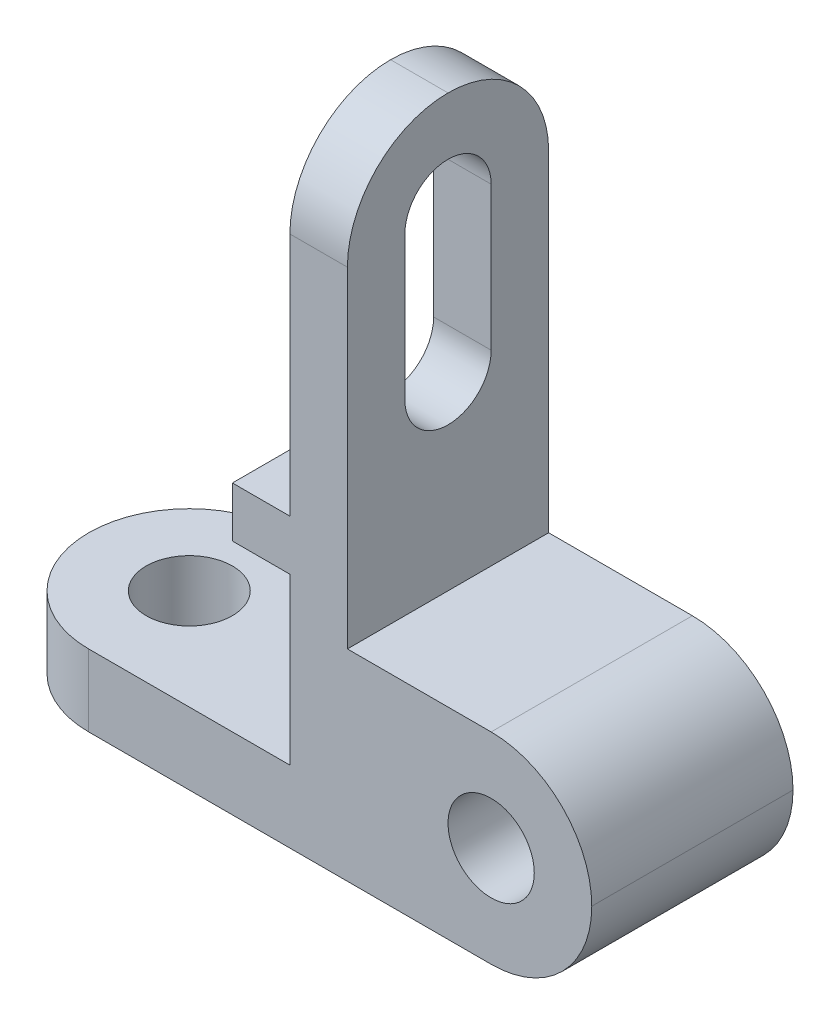
ISO-10303-21;
HEADER;
FILE_DESCRIPTION(('STEP AP214'),'2;1');
FILE_NAME('part.step','',(''),(''),'','','');
FILE_SCHEMA(('AUTOMOTIVE_DESIGN { 1 0 10303 214 1 1 1 1 }'));
ENDSEC;
DATA;
#1=APPLICATION_CONTEXT('core data for automotive mechanical design processes');
#2=APPLICATION_PROTOCOL_DEFINITION('international standard','automotive_design',2000,#1);
#3=PRODUCT_CONTEXT('',#1,'mechanical');
#4=PRODUCT('Part','Part','',(#3));
#5=PRODUCT_RELATED_PRODUCT_CATEGORY('part','',(#4));
#6=PRODUCT_DEFINITION_FORMATION('','',#4);
#7=PRODUCT_DEFINITION_CONTEXT('part definition',#1,'design');
#8=PRODUCT_DEFINITION('design','',#6,#7);
#9=PRODUCT_DEFINITION_SHAPE('','',#8);
#10=(LENGTH_UNIT() NAMED_UNIT(*) SI_UNIT(.MILLI.,.METRE.));
#11=(NAMED_UNIT(*) PLANE_ANGLE_UNIT() SI_UNIT($,.RADIAN.));
#12=(NAMED_UNIT(*) SI_UNIT($,.STERADIAN.) SOLID_ANGLE_UNIT());
#13=UNCERTAINTY_MEASURE_WITH_UNIT(LENGTH_MEASURE(1.E-05),#10,'distance_accuracy_value','');
#14=(GEOMETRIC_REPRESENTATION_CONTEXT(3) GLOBAL_UNCERTAINTY_ASSIGNED_CONTEXT((#13)) GLOBAL_UNIT_ASSIGNED_CONTEXT((#10,
#11,#12)) REPRESENTATION_CONTEXT('',''));
#15=CARTESIAN_POINT('',(0.,0.,0.));
#16=DIRECTION('',(0.,0.,1.));
#17=DIRECTION('',(1.,0.,0.));
#18=AXIS2_PLACEMENT_3D('',#15,#16,#17);
#19=CARTESIAN_POINT('',(0.,0.,14.));
#20=DIRECTION('',(0.,0.,1.));
#21=DIRECTION('',(1.,0.,0.));
#22=AXIS2_PLACEMENT_3D('',#19,#20,#21);
#23=PLANE('',#22);
#24=DIRECTION('',(-1.,0.,0.));
#25=VECTOR('',#24,1.);
#26=CARTESIAN_POINT('',(-42.,9.99999999999999,14.));
#27=LINE('',#26,#25);
#28=CARTESIAN_POINT('',(-42.,9.99999999999999,14.));
#29=VERTEX_POINT('',#28);
#30=CARTESIAN_POINT('',(-70.,9.99999999999999,14.));
#31=VERTEX_POINT('',#30);
#32=EDGE_CURVE('E228',#29,#31,#27,.T.);
#33=ORIENTED_EDGE('',*,*,#32,.T.);
#34=DIRECTION('',(0.,-1.,0.));
#35=VECTOR('',#34,1.);
#36=CARTESIAN_POINT('',(-70.,0.,14.));
#37=LINE('',#36,#35);
#38=CARTESIAN_POINT('',(-70.,0.,14.));
#39=VERTEX_POINT('',#38);
#40=EDGE_CURVE('E294',#31,#39,#37,.T.);
#41=ORIENTED_EDGE('',*,*,#40,.T.);
#42=DIRECTION('',(1.,0.,0.));
#43=VECTOR('',#42,1.);
#44=CARTESIAN_POINT('',(-84.,0.,14.));
#45=LINE('',#44,#43);
#46=CARTESIAN_POINT('',(-14.,0.,14.));
#47=VERTEX_POINT('',#46);
#48=EDGE_CURVE('E209',#39,#47,#45,.T.);
#49=ORIENTED_EDGE('',*,*,#48,.T.);
#50=CARTESIAN_POINT('',(-14.,14.,14.));
#51=DIRECTION('',(0.,0.,1.));
#52=DIRECTION('',(1.,0.,0.));
#53=AXIS2_PLACEMENT_3D('',#50,#51,#52);
#54=CIRCLE('',#53,14.);
#55=CARTESIAN_POINT('',(0.,14.,14.));
#56=VERTEX_POINT('',#55);
#57=EDGE_CURVE('E290',#47,#56,#54,.T.);
#58=ORIENTED_EDGE('',*,*,#57,.T.);
#59=CARTESIAN_POINT('',(-14.,14.,14.));
#60=DIRECTION('',(0.,0.,1.));
#61=DIRECTION('',(1.,0.,0.));
#62=AXIS2_PLACEMENT_3D('',#59,#60,#61);
#63=CIRCLE('',#62,14.);
#64=CARTESIAN_POINT('',(-14.,28.,14.));
#65=VERTEX_POINT('',#64);
#66=EDGE_CURVE('E288',#56,#65,#63,.T.);
#67=ORIENTED_EDGE('',*,*,#66,.T.);
#68=DIRECTION('',(-1.,0.,0.));
#69=VECTOR('',#68,1.);
#70=CARTESIAN_POINT('',(0.,28.,14.));
#71=LINE('',#70,#69);
#72=CARTESIAN_POINT('',(-34.,28.,14.));
#73=VERTEX_POINT('',#72);
#74=EDGE_CURVE('E212',#65,#73,#71,.T.);
#75=ORIENTED_EDGE('',*,*,#74,.T.);
#76=DIRECTION('',(0.,1.,0.));
#77=VECTOR('',#76,1.);
#78=CARTESIAN_POINT('',(-34.,28.,14.));
#79=LINE('',#78,#77);
#80=CARTESIAN_POINT('',(-34.,74.,14.));
#81=VERTEX_POINT('',#80);
#82=EDGE_CURVE('E215',#73,#81,#79,.T.);
#83=ORIENTED_EDGE('',*,*,#82,.T.);
#84=DIRECTION('',(-1.,0.,0.));
#85=VECTOR('',#84,1.);
#86=CARTESIAN_POINT('',(-42.,74.,14.));
#87=LINE('',#86,#85);
#88=CARTESIAN_POINT('',(-42.,74.,14.));
#89=VERTEX_POINT('',#88);
#90=EDGE_CURVE('E292',#81,#89,#87,.T.);
#91=ORIENTED_EDGE('',*,*,#90,.T.);
#92=DIRECTION('',(0.,-1.,0.));
#93=VECTOR('',#92,1.);
#94=CARTESIAN_POINT('',(-42.,88.,14.));
#95=LINE('',#94,#93);
#96=CARTESIAN_POINT('',(-42.,40.,14.));
#97=VERTEX_POINT('',#96);
#98=EDGE_CURVE('E218',#89,#97,#95,.T.);
#99=ORIENTED_EDGE('',*,*,#98,.T.);
#100=DIRECTION('',(-1.,0.,0.));
#101=VECTOR('',#100,1.);
#102=CARTESIAN_POINT('',(-42.,40.,14.));
#103=LINE('',#102,#101);
#104=CARTESIAN_POINT('',(-50.,40.,14.));
#105=VERTEX_POINT('',#104);
#106=EDGE_CURVE('E220',#97,#105,#103,.T.);
#107=ORIENTED_EDGE('',*,*,#106,.T.);
#108=DIRECTION('',(0.,-1.,0.));
#109=VECTOR('',#108,1.);
#110=CARTESIAN_POINT('',(-50.,40.,14.));
#111=LINE('',#110,#109);
#112=CARTESIAN_POINT('',(-50.,33.,14.));
#113=VERTEX_POINT('',#112);
#114=EDGE_CURVE('E222',#105,#113,#111,.T.);
#115=ORIENTED_EDGE('',*,*,#114,.T.);
#116=DIRECTION('',(1.,0.,0.));
#117=VECTOR('',#116,1.);
#118=CARTESIAN_POINT('',(-50.,33.,14.));
#119=LINE('',#118,#117);
#120=CARTESIAN_POINT('',(-42.,33.,14.));
#121=VERTEX_POINT('',#120);
#122=EDGE_CURVE('E224',#113,#121,#119,.T.);
#123=ORIENTED_EDGE('',*,*,#122,.T.);
#124=DIRECTION('',(0.,-1.,0.));
#125=VECTOR('',#124,1.);
#126=CARTESIAN_POINT('',(-42.,33.,14.));
#127=LINE('',#126,#125);
#128=EDGE_CURVE('E226',#121,#29,#127,.T.);
#129=ORIENTED_EDGE('',*,*,#128,.T.);
#130=EDGE_LOOP('',(#33,#41,#49,#58,#67,#75,#83,#91,#99,#107,#115,#123,#129));
#131=FACE_BOUND('',#130,.T.);
#132=CARTESIAN_POINT('',(-14.,14.,14.));
#133=DIRECTION('',(0.,0.,1.));
#134=DIRECTION('',(1.,0.,0.));
#135=AXIS2_PLACEMENT_3D('',#132,#133,#134);
#136=CIRCLE('',#135,6.);
#137=CARTESIAN_POINT('',(-8.,14.,14.));
#138=VERTEX_POINT('',#137);
#139=EDGE_CURVE('E203',#138,#138,#136,.T.);
#140=ORIENTED_EDGE('',*,*,#139,.F.);
#141=EDGE_LOOP('',(#140));
#142=FACE_BOUND('',#141,.T.);
#143=ADVANCED_FACE('F33',(#131,#142),#23,.T.);
#144=CARTESIAN_POINT('',(0.,0.,-14.));
#145=DIRECTION('',(0.,0.,1.));
#146=DIRECTION('',(1.,0.,0.));
#147=AXIS2_PLACEMENT_3D('',#144,#145,#146);
#148=PLANE('',#147);
#149=DIRECTION('',(1.,0.,0.));
#150=VECTOR('',#149,1.);
#151=CARTESIAN_POINT('',(-84.,0.,-14.));
#152=LINE('',#151,#150);
#153=CARTESIAN_POINT('',(-70.,0.,-14.));
#154=VERTEX_POINT('',#153);
#155=CARTESIAN_POINT('',(-14.,0.,-14.));
#156=VERTEX_POINT('',#155);
#157=EDGE_CURVE('E206',#154,#156,#152,.T.);
#158=ORIENTED_EDGE('',*,*,#157,.F.);
#159=DIRECTION('',(0.,-1.,0.));
#160=VECTOR('',#159,1.);
#161=CARTESIAN_POINT('',(-70.,0.,-14.));
#162=LINE('',#161,#160);
#163=CARTESIAN_POINT('',(-70.,9.99999999999999,-14.));
#164=VERTEX_POINT('',#163);
#165=EDGE_CURVE('E281',#154,#164,#162,.F.);
#166=ORIENTED_EDGE('',*,*,#165,.T.);
#167=DIRECTION('',(-1.,0.,0.));
#168=VECTOR('',#167,1.);
#169=CARTESIAN_POINT('',(-42.,9.99999999999999,-14.));
#170=LINE('',#169,#168);
#171=CARTESIAN_POINT('',(-42.,9.99999999999999,-14.));
#172=VERTEX_POINT('',#171);
#173=EDGE_CURVE('E213',#172,#164,#170,.T.);
#174=ORIENTED_EDGE('',*,*,#173,.F.);
#175=DIRECTION('',(0.,-1.,0.));
#176=VECTOR('',#175,1.);
#177=CARTESIAN_POINT('',(-42.,33.,-14.));
#178=LINE('',#177,#176);
#179=CARTESIAN_POINT('',(-42.,33.,-14.));
#180=VERTEX_POINT('',#179);
#181=EDGE_CURVE('E246',#180,#172,#178,.T.);
#182=ORIENTED_EDGE('',*,*,#181,.F.);
#183=DIRECTION('',(1.,0.,0.));
#184=VECTOR('',#183,1.);
#185=CARTESIAN_POINT('',(-50.,33.,-14.));
#186=LINE('',#185,#184);
#187=CARTESIAN_POINT('',(-50.,33.,-14.));
#188=VERTEX_POINT('',#187);
#189=EDGE_CURVE('E244',#188,#180,#186,.T.);
#190=ORIENTED_EDGE('',*,*,#189,.F.);
#191=DIRECTION('',(0.,-1.,0.));
#192=VECTOR('',#191,1.);
#193=CARTESIAN_POINT('',(-50.,40.,-14.));
#194=LINE('',#193,#192);
#195=CARTESIAN_POINT('',(-50.,40.,-14.));
#196=VERTEX_POINT('',#195);
#197=EDGE_CURVE('E242',#196,#188,#194,.T.);
#198=ORIENTED_EDGE('',*,*,#197,.F.);
#199=DIRECTION('',(-1.,0.,0.));
#200=VECTOR('',#199,1.);
#201=CARTESIAN_POINT('',(-42.,40.,-14.));
#202=LINE('',#201,#200);
#203=CARTESIAN_POINT('',(-42.,40.,-14.));
#204=VERTEX_POINT('',#203);
#205=EDGE_CURVE('E240',#204,#196,#202,.T.);
#206=ORIENTED_EDGE('',*,*,#205,.F.);
#207=DIRECTION('',(0.,-1.,0.));
#208=VECTOR('',#207,1.);
#209=CARTESIAN_POINT('',(-42.,88.,-14.));
#210=LINE('',#209,#208);
#211=CARTESIAN_POINT('',(-42.,74.,-14.));
#212=VERTEX_POINT('',#211);
#213=EDGE_CURVE('E238',#212,#204,#210,.T.);
#214=ORIENTED_EDGE('',*,*,#213,.F.);
#215=DIRECTION('',(-1.,0.,0.));
#216=VECTOR('',#215,1.);
#217=CARTESIAN_POINT('',(0.,74.,-14.));
#218=LINE('',#217,#216);
#219=CARTESIAN_POINT('',(-34.,74.,-14.));
#220=VERTEX_POINT('',#219);
#221=EDGE_CURVE('E278',#212,#220,#218,.F.);
#222=ORIENTED_EDGE('',*,*,#221,.T.);
#223=DIRECTION('',(0.,1.,0.));
#224=VECTOR('',#223,1.);
#225=CARTESIAN_POINT('',(-34.,28.,-14.));
#226=LINE('',#225,#224);
#227=CARTESIAN_POINT('',(-34.,28.,-14.));
#228=VERTEX_POINT('',#227);
#229=EDGE_CURVE('E236',#228,#220,#226,.T.);
#230=ORIENTED_EDGE('',*,*,#229,.F.);
#231=DIRECTION('',(-1.,0.,0.));
#232=VECTOR('',#231,1.);
#233=CARTESIAN_POINT('',(0.,28.,-14.));
#234=LINE('',#233,#232);
#235=CARTESIAN_POINT('',(-14.,28.,-14.));
#236=VERTEX_POINT('',#235);
#237=EDGE_CURVE('E234',#236,#228,#234,.T.);
#238=ORIENTED_EDGE('',*,*,#237,.F.);
#239=CARTESIAN_POINT('',(-14.,14.,-14.));
#240=DIRECTION('',(0.,0.,1.));
#241=DIRECTION('',(1.,0.,0.));
#242=AXIS2_PLACEMENT_3D('',#239,#240,#241);
#243=CIRCLE('',#242,14.);
#244=CARTESIAN_POINT('',(0.,14.,-14.));
#245=VERTEX_POINT('',#244);
#246=EDGE_CURVE('E274',#236,#245,#243,.F.);
#247=ORIENTED_EDGE('',*,*,#246,.T.);
#248=CARTESIAN_POINT('',(-14.,14.,-14.));
#249=DIRECTION('',(0.,0.,1.));
#250=DIRECTION('',(1.,0.,0.));
#251=AXIS2_PLACEMENT_3D('',#248,#249,#250);
#252=CIRCLE('',#251,14.);
#253=EDGE_CURVE('E276',#245,#156,#252,.F.);
#254=ORIENTED_EDGE('',*,*,#253,.T.);
#255=EDGE_LOOP('',(#158,#166,#174,#182,#190,#198,#206,#214,#222,#230,#238,#247,#254));
#256=FACE_BOUND('',#255,.T.);
#257=CARTESIAN_POINT('',(-14.,14.,-14.));
#258=DIRECTION('',(0.,0.,1.));
#259=DIRECTION('',(1.,0.,0.));
#260=AXIS2_PLACEMENT_3D('',#257,#258,#259);
#261=CIRCLE('',#260,6.);
#262=CARTESIAN_POINT('',(-8.,14.,-14.));
#263=VERTEX_POINT('',#262);
#264=EDGE_CURVE('E201',#263,#263,#261,.T.);
#265=ORIENTED_EDGE('',*,*,#264,.T.);
#266=EDGE_LOOP('',(#265));
#267=FACE_BOUND('',#266,.T.);
#268=ADVANCED_FACE('F339',(#256,#267),#148,.F.);
#269=CARTESIAN_POINT('',(-84.,0.,14.));
#270=DIRECTION('',(0.,1.,0.));
#271=DIRECTION('',(0.,0.,1.));
#272=AXIS2_PLACEMENT_3D('',#269,#270,#271);
#273=PLANE('',#272);
#274=CARTESIAN_POINT('',(-70.,0.,0.));
#275=DIRECTION('',(0.,1.,0.));
#276=DIRECTION('',(0.,0.,1.));
#277=AXIS2_PLACEMENT_3D('',#274,#275,#276);
#278=CIRCLE('',#277,6.);
#279=CARTESIAN_POINT('',(-70.,0.,6.));
#280=VERTEX_POINT('',#279);
#281=EDGE_CURVE('E420',#280,#280,#278,.F.);
#282=ORIENTED_EDGE('',*,*,#281,.F.);
#283=EDGE_LOOP('',(#282));
#284=FACE_BOUND('',#283,.T.);
#285=CARTESIAN_POINT('',(-70.,0.,0.));
#286=DIRECTION('',(0.,1.,0.));
#287=DIRECTION('',(0.,0.,1.));
#288=AXIS2_PLACEMENT_3D('',#285,#286,#287);
#289=CIRCLE('',#288,14.);
#290=CARTESIAN_POINT('',(-84.,0.,0.));
#291=VERTEX_POINT('',#290);
#292=EDGE_CURVE('E270',#39,#291,#289,.F.);
#293=ORIENTED_EDGE('',*,*,#292,.T.);
#294=CARTESIAN_POINT('',(-70.,0.,0.));
#295=DIRECTION('',(0.,1.,0.));
#296=DIRECTION('',(0.,0.,1.));
#297=AXIS2_PLACEMENT_3D('',#294,#295,#296);
#298=CIRCLE('',#297,14.);
#299=EDGE_CURVE('E272',#291,#154,#298,.F.);
#300=ORIENTED_EDGE('',*,*,#299,.T.);
#301=ORIENTED_EDGE('',*,*,#157,.T.);
#302=DIRECTION('',(0.,0.,-1.));
#303=VECTOR('',#302,1.);
#304=CARTESIAN_POINT('',(-14.,0.,14.));
#305=LINE('',#304,#303);
#306=EDGE_CURVE('E267',#156,#47,#305,.F.);
#307=ORIENTED_EDGE('',*,*,#306,.T.);
#308=ORIENTED_EDGE('',*,*,#48,.F.);
#309=EDGE_LOOP('',(#293,#300,#301,#307,#308));
#310=FACE_BOUND('',#309,.T.);
#311=ADVANCED_FACE('F373',(#284,#310),#273,.F.);
#312=CARTESIAN_POINT('',(0.,28.,14.));
#313=DIRECTION('',(0.,-1.,0.));
#314=DIRECTION('',(0.,0.,-1.));
#315=AXIS2_PLACEMENT_3D('',#312,#313,#314);
#316=PLANE('',#315);
#317=ORIENTED_EDGE('',*,*,#74,.F.);
#318=DIRECTION('',(0.,0.,-1.));
#319=VECTOR('',#318,1.);
#320=CARTESIAN_POINT('',(-14.,28.,14.));
#321=LINE('',#320,#319);
#322=EDGE_CURVE('E11',#65,#236,#321,.T.);
#323=ORIENTED_EDGE('',*,*,#322,.T.);
#324=ORIENTED_EDGE('',*,*,#237,.T.);
#325=DIRECTION('',(0.,0.,-1.));
#326=VECTOR('',#325,1.);
#327=CARTESIAN_POINT('',(-34.,28.,14.));
#328=LINE('',#327,#326);
#329=EDGE_CURVE('E264',#73,#228,#328,.T.);
#330=ORIENTED_EDGE('',*,*,#329,.F.);
#331=EDGE_LOOP('',(#317,#323,#324,#330));
#332=FACE_BOUND('',#331,.T.);
#333=ADVANCED_FACE('F324',(#332),#316,.F.);
#334=CARTESIAN_POINT('',(-34.,28.,14.));
#335=DIRECTION('',(-1.,0.,0.));
#336=DIRECTION('',(0.,0.,1.));
#337=AXIS2_PLACEMENT_3D('',#334,#335,#336);
#338=PLANE('',#337);
#339=DIRECTION('',(0.,1.,0.));
#340=VECTOR('',#339,1.);
#341=CARTESIAN_POINT('',(-34.,54.,-6.));
#342=LINE('',#341,#340);
#343=CARTESIAN_POINT('',(-34.,54.,-6.));
#344=VERTEX_POINT('',#343);
#345=CARTESIAN_POINT('',(-34.,74.,-6.));
#346=VERTEX_POINT('',#345);
#347=EDGE_CURVE('E181',#344,#346,#342,.T.);
#348=ORIENTED_EDGE('',*,*,#347,.F.);
#349=CARTESIAN_POINT('',(-34.,54.,0.));
#350=DIRECTION('',(1.,0.,0.));
#351=DIRECTION('',(0.,0.,-1.));
#352=AXIS2_PLACEMENT_3D('',#349,#350,#351);
#353=CIRCLE('',#352,6.);
#354=CARTESIAN_POINT('',(-34.,54.,6.));
#355=VERTEX_POINT('',#354);
#356=EDGE_CURVE('E186',#355,#344,#353,.T.);
#357=ORIENTED_EDGE('',*,*,#356,.F.);
#358=DIRECTION('',(0.,-1.,0.));
#359=VECTOR('',#358,1.);
#360=CARTESIAN_POINT('',(-34.,54.,6.));
#361=LINE('',#360,#359);
#362=CARTESIAN_POINT('',(-34.,74.,6.));
#363=VERTEX_POINT('',#362);
#364=EDGE_CURVE('E190',#363,#355,#361,.T.);
#365=ORIENTED_EDGE('',*,*,#364,.F.);
#366=CARTESIAN_POINT('',(-34.,74.,0.));
#367=DIRECTION('',(1.,0.,0.));
#368=DIRECTION('',(0.,0.,-1.));
#369=AXIS2_PLACEMENT_3D('',#366,#367,#368);
#370=CIRCLE('',#369,6.);
#371=EDGE_CURVE('E170',#346,#363,#370,.T.);
#372=ORIENTED_EDGE('',*,*,#371,.F.);
#373=EDGE_LOOP('',(#348,#357,#365,#372));
#374=FACE_BOUND('',#373,.T.);
#375=ORIENTED_EDGE('',*,*,#229,.T.);
#376=CARTESIAN_POINT('',(-34.,74.,0.));
#377=DIRECTION('',(-1.,0.,0.));
#378=DIRECTION('',(0.,0.,1.));
#379=AXIS2_PLACEMENT_3D('',#376,#377,#378);
#380=CIRCLE('',#379,14.);
#381=CARTESIAN_POINT('',(-34.,88.,0.));
#382=VERTEX_POINT('',#381);
#383=EDGE_CURVE('E42',#220,#382,#380,.F.);
#384=ORIENTED_EDGE('',*,*,#383,.T.);
#385=CARTESIAN_POINT('',(-34.,74.,0.));
#386=DIRECTION('',(-1.,0.,0.));
#387=DIRECTION('',(0.,0.,1.));
#388=AXIS2_PLACEMENT_3D('',#385,#386,#387);
#389=CIRCLE('',#388,14.);
#390=EDGE_CURVE('E299',#382,#81,#389,.F.);
#391=ORIENTED_EDGE('',*,*,#390,.T.);
#392=ORIENTED_EDGE('',*,*,#82,.F.);
#393=ORIENTED_EDGE('',*,*,#329,.T.);
#394=EDGE_LOOP('',(#375,#384,#391,#392,#393));
#395=FACE_BOUND('',#394,.T.);
#396=ADVANCED_FACE('F188',(#374,#395),#338,.F.);
#397=CARTESIAN_POINT('',(-42.,88.,14.));
#398=DIRECTION('',(1.,0.,0.));
#399=DIRECTION('',(0.,1.,0.));
#400=AXIS2_PLACEMENT_3D('',#397,#398,#399);
#401=PLANE('',#400);
#402=DIRECTION('',(0.,1.,0.));
#403=VECTOR('',#402,1.);
#404=CARTESIAN_POINT('',(-42.,54.,6.));
#405=LINE('',#404,#403);
#406=CARTESIAN_POINT('',(-42.,54.,6.));
#407=VERTEX_POINT('',#406);
#408=CARTESIAN_POINT('',(-42.,74.,6.));
#409=VERTEX_POINT('',#408);
#410=EDGE_CURVE('E427',#407,#409,#405,.T.);
#411=ORIENTED_EDGE('',*,*,#410,.F.);
#412=CARTESIAN_POINT('',(-42.,54.,0.));
#413=DIRECTION('',(1.,0.,0.));
#414=DIRECTION('',(0.,1.,0.));
#415=AXIS2_PLACEMENT_3D('',#412,#413,#414);
#416=CIRCLE('',#415,6.);
#417=CARTESIAN_POINT('',(-42.,54.,-6.));
#418=VERTEX_POINT('',#417);
#419=EDGE_CURVE('E202',#418,#407,#416,.F.);
#420=ORIENTED_EDGE('',*,*,#419,.F.);
#421=DIRECTION('',(0.,-1.,0.));
#422=VECTOR('',#421,1.);
#423=CARTESIAN_POINT('',(-42.,54.,-6.));
#424=LINE('',#423,#422);
#425=CARTESIAN_POINT('',(-42.,74.,-6.));
#426=VERTEX_POINT('',#425);
#427=EDGE_CURVE('E199',#426,#418,#424,.T.);
#428=ORIENTED_EDGE('',*,*,#427,.F.);
#429=CARTESIAN_POINT('',(-42.,74.,0.));
#430=DIRECTION('',(1.,0.,0.));
#431=DIRECTION('',(0.,1.,0.));
#432=AXIS2_PLACEMENT_3D('',#429,#430,#431);
#433=CIRCLE('',#432,6.);
#434=EDGE_CURVE('E173',#409,#426,#433,.F.);
#435=ORIENTED_EDGE('',*,*,#434,.F.);
#436=EDGE_LOOP('',(#411,#420,#428,#435));
#437=FACE_BOUND('',#436,.T.);
#438=CARTESIAN_POINT('',(-42.,74.,0.));
#439=DIRECTION('',(1.,0.,0.));
#440=DIRECTION('',(0.,1.,0.));
#441=AXIS2_PLACEMENT_3D('',#438,#439,#440);
#442=CIRCLE('',#441,14.);
#443=CARTESIAN_POINT('',(-42.,88.,0.));
#444=VERTEX_POINT('',#443);
#445=EDGE_CURVE('E57',#89,#444,#442,.F.);
#446=ORIENTED_EDGE('',*,*,#445,.T.);
#447=CARTESIAN_POINT('',(-42.,74.,0.));
#448=DIRECTION('',(1.,0.,0.));
#449=DIRECTION('',(0.,1.,0.));
#450=AXIS2_PLACEMENT_3D('',#447,#448,#449);
#451=CIRCLE('',#450,14.);
#452=EDGE_CURVE('E297',#444,#212,#451,.F.);
#453=ORIENTED_EDGE('',*,*,#452,.T.);
#454=ORIENTED_EDGE('',*,*,#213,.T.);
#455=DIRECTION('',(0.,0.,-1.));
#456=VECTOR('',#455,1.);
#457=CARTESIAN_POINT('',(-42.,40.,14.));
#458=LINE('',#457,#456);
#459=EDGE_CURVE('E261',#97,#204,#458,.T.);
#460=ORIENTED_EDGE('',*,*,#459,.F.);
#461=ORIENTED_EDGE('',*,*,#98,.F.);
#462=EDGE_LOOP('',(#446,#453,#454,#460,#461));
#463=FACE_BOUND('',#462,.T.);
#464=ADVANCED_FACE('F334',(#437,#463),#401,.F.);
#465=CARTESIAN_POINT('',(-42.,40.,14.));
#466=DIRECTION('',(0.,-1.,0.));
#467=DIRECTION('',(0.,0.,-1.));
#468=AXIS2_PLACEMENT_3D('',#465,#466,#467);
#469=PLANE('',#468);
#470=ORIENTED_EDGE('',*,*,#205,.T.);
#471=DIRECTION('',(0.,0.,-1.));
#472=VECTOR('',#471,1.);
#473=CARTESIAN_POINT('',(-50.,40.,14.));
#474=LINE('',#473,#472);
#475=EDGE_CURVE('E258',#105,#196,#474,.T.);
#476=ORIENTED_EDGE('',*,*,#475,.F.);
#477=ORIENTED_EDGE('',*,*,#106,.F.);
#478=ORIENTED_EDGE('',*,*,#459,.T.);
#479=EDGE_LOOP('',(#470,#476,#477,#478));
#480=FACE_BOUND('',#479,.T.);
#481=ADVANCED_FACE('F345',(#480),#469,.F.);
#482=CARTESIAN_POINT('',(-50.,40.,14.));
#483=DIRECTION('',(1.,0.,0.));
#484=DIRECTION('',(0.,0.,-1.));
#485=AXIS2_PLACEMENT_3D('',#482,#483,#484);
#486=PLANE('',#485);
#487=ORIENTED_EDGE('',*,*,#197,.T.);
#488=DIRECTION('',(0.,0.,-1.));
#489=VECTOR('',#488,1.);
#490=CARTESIAN_POINT('',(-50.,33.,14.));
#491=LINE('',#490,#489);
#492=EDGE_CURVE('E255',#113,#188,#491,.T.);
#493=ORIENTED_EDGE('',*,*,#492,.F.);
#494=ORIENTED_EDGE('',*,*,#114,.F.);
#495=ORIENTED_EDGE('',*,*,#475,.T.);
#496=EDGE_LOOP('',(#487,#493,#494,#495));
#497=FACE_BOUND('',#496,.T.);
#498=ADVANCED_FACE('F349',(#497),#486,.F.);
#499=CARTESIAN_POINT('',(-50.,33.,14.));
#500=DIRECTION('',(0.,1.,0.));
#501=DIRECTION('',(0.,0.,1.));
#502=AXIS2_PLACEMENT_3D('',#499,#500,#501);
#503=PLANE('',#502);
#504=ORIENTED_EDGE('',*,*,#189,.T.);
#505=DIRECTION('',(0.,0.,-1.));
#506=VECTOR('',#505,1.);
#507=CARTESIAN_POINT('',(-42.,33.,14.));
#508=LINE('',#507,#506);
#509=EDGE_CURVE('E252',#121,#180,#508,.T.);
#510=ORIENTED_EDGE('',*,*,#509,.F.);
#511=ORIENTED_EDGE('',*,*,#122,.F.);
#512=ORIENTED_EDGE('',*,*,#492,.T.);
#513=EDGE_LOOP('',(#504,#510,#511,#512));
#514=FACE_BOUND('',#513,.T.);
#515=ADVANCED_FACE('F356',(#514),#503,.F.);
#516=CARTESIAN_POINT('',(-42.,33.,14.));
#517=DIRECTION('',(1.,0.,0.));
#518=DIRECTION('',(0.,0.,-1.));
#519=AXIS2_PLACEMENT_3D('',#516,#517,#518);
#520=PLANE('',#519);
#521=ORIENTED_EDGE('',*,*,#181,.T.);
#522=DIRECTION('',(0.,0.,-1.));
#523=VECTOR('',#522,1.);
#524=CARTESIAN_POINT('',(-42.,9.99999999999999,14.));
#525=LINE('',#524,#523);
#526=EDGE_CURVE('E231',#29,#172,#525,.T.);
#527=ORIENTED_EDGE('',*,*,#526,.F.);
#528=ORIENTED_EDGE('',*,*,#128,.F.);
#529=ORIENTED_EDGE('',*,*,#509,.T.);
#530=EDGE_LOOP('',(#521,#527,#528,#529));
#531=FACE_BOUND('',#530,.T.);
#532=ADVANCED_FACE('F359',(#531),#520,.F.);
#533=CARTESIAN_POINT('',(-42.,9.99999999999999,14.));
#534=DIRECTION('',(0.,-1.,0.));
#535=DIRECTION('',(1.,0.,0.));
#536=AXIS2_PLACEMENT_3D('',#533,#534,#535);
#537=PLANE('',#536);
#538=CARTESIAN_POINT('',(-70.,9.99999999999999,0.));
#539=DIRECTION('',(0.,1.,0.));
#540=DIRECTION('',(-1.,0.,0.));
#541=AXIS2_PLACEMENT_3D('',#538,#539,#540);
#542=CIRCLE('',#541,6.);
#543=CARTESIAN_POINT('',(-76.,9.99999999999999,0.));
#544=VERTEX_POINT('',#543);
#545=EDGE_CURVE('E304',#544,#544,#542,.T.);
#546=ORIENTED_EDGE('',*,*,#545,.F.);
#547=EDGE_LOOP('',(#546));
#548=FACE_BOUND('',#547,.T.);
#549=ORIENTED_EDGE('',*,*,#173,.T.);
#550=CARTESIAN_POINT('',(-70.,9.99999999999999,0.));
#551=DIRECTION('',(0.,-1.,0.));
#552=DIRECTION('',(1.,0.,0.));
#553=AXIS2_PLACEMENT_3D('',#550,#551,#552);
#554=CIRCLE('',#553,14.);
#555=CARTESIAN_POINT('',(-84.,9.99999999999999,0.));
#556=VERTEX_POINT('',#555);
#557=EDGE_CURVE('E286',#164,#556,#554,.F.);
#558=ORIENTED_EDGE('',*,*,#557,.T.);
#559=CARTESIAN_POINT('',(-70.,9.99999999999999,0.));
#560=DIRECTION('',(0.,-1.,0.));
#561=DIRECTION('',(1.,0.,0.));
#562=AXIS2_PLACEMENT_3D('',#559,#560,#561);
#563=CIRCLE('',#562,14.);
#564=EDGE_CURVE('E284',#556,#31,#563,.F.);
#565=ORIENTED_EDGE('',*,*,#564,.T.);
#566=ORIENTED_EDGE('',*,*,#32,.F.);
#567=ORIENTED_EDGE('',*,*,#526,.T.);
#568=EDGE_LOOP('',(#549,#558,#565,#566,#567));
#569=FACE_BOUND('',#568,.T.);
#570=ADVANCED_FACE('F363',(#548,#569),#537,.F.);
#571=CARTESIAN_POINT('',(-14.,14.,14.));
#572=DIRECTION('',(0.,0.,-1.));
#573=DIRECTION('',(-1.,0.,0.));
#574=AXIS2_PLACEMENT_3D('',#571,#572,#573);
#575=CYLINDRICAL_SURFACE('',#574,6.);
#576=ORIENTED_EDGE('',*,*,#139,.T.);
#577=EDGE_LOOP('',(#576));
#578=FACE_BOUND('',#577,.T.);
#579=ORIENTED_EDGE('',*,*,#264,.F.);
#580=EDGE_LOOP('',(#579));
#581=FACE_BOUND('',#580,.T.);
#582=ADVANCED_FACE('F394',(#578,#581),#575,.F.);
#583=CARTESIAN_POINT('',(-76.1760149812701,54.,0.));
#584=DIRECTION('',(1.,0.,0.));
#585=DIRECTION('',(0.,0.,-1.));
#586=AXIS2_PLACEMENT_3D('',#583,#584,#585);
#587=CYLINDRICAL_SURFACE('',#586,6.);
#588=ORIENTED_EDGE('',*,*,#419,.T.);
#589=DIRECTION('',(1.,0.,0.));
#590=VECTOR('',#589,1.);
#591=CARTESIAN_POINT('',(-76.1760149812701,54.,6.));
#592=LINE('',#591,#590);
#593=EDGE_CURVE('E195',#407,#355,#592,.T.);
#594=ORIENTED_EDGE('',*,*,#593,.T.);
#595=ORIENTED_EDGE('',*,*,#356,.T.);
#596=DIRECTION('',(1.,0.,0.));
#597=VECTOR('',#596,1.);
#598=CARTESIAN_POINT('',(-76.1760149812701,54.,-6.));
#599=LINE('',#598,#597);
#600=EDGE_CURVE('E177',#418,#344,#599,.T.);
#601=ORIENTED_EDGE('',*,*,#600,.F.);
#602=EDGE_LOOP('',(#588,#594,#595,#601));
#603=FACE_BOUND('',#602,.T.);
#604=ADVANCED_FACE('F432',(#603),#587,.F.);
#605=CARTESIAN_POINT('',(-76.1760149812701,54.,6.));
#606=DIRECTION('',(0.,0.,1.));
#607=DIRECTION('',(1.,0.,0.));
#608=AXIS2_PLACEMENT_3D('',#605,#606,#607);
#609=PLANE('',#608);
#610=ORIENTED_EDGE('',*,*,#410,.T.);
#611=DIRECTION('',(1.,0.,0.));
#612=VECTOR('',#611,1.);
#613=CARTESIAN_POINT('',(-76.1760149812701,74.,6.));
#614=LINE('',#613,#612);
#615=EDGE_CURVE('E176',#409,#363,#614,.T.);
#616=ORIENTED_EDGE('',*,*,#615,.T.);
#617=ORIENTED_EDGE('',*,*,#364,.T.);
#618=ORIENTED_EDGE('',*,*,#593,.F.);
#619=EDGE_LOOP('',(#610,#616,#617,#618));
#620=FACE_BOUND('',#619,.T.);
#621=ADVANCED_FACE('F435',(#620),#609,.F.);
#622=CARTESIAN_POINT('',(-76.1760149812701,74.,0.));
#623=DIRECTION('',(1.,0.,0.));
#624=DIRECTION('',(0.,0.,-1.));
#625=AXIS2_PLACEMENT_3D('',#622,#623,#624);
#626=CYLINDRICAL_SURFACE('',#625,6.);
#627=ORIENTED_EDGE('',*,*,#434,.T.);
#628=DIRECTION('',(1.,0.,0.));
#629=VECTOR('',#628,1.);
#630=CARTESIAN_POINT('',(-76.1760149812701,74.,-6.));
#631=LINE('',#630,#629);
#632=EDGE_CURVE('E165',#426,#346,#631,.T.);
#633=ORIENTED_EDGE('',*,*,#632,.T.);
#634=ORIENTED_EDGE('',*,*,#371,.T.);
#635=ORIENTED_EDGE('',*,*,#615,.F.);
#636=EDGE_LOOP('',(#627,#633,#634,#635));
#637=FACE_BOUND('',#636,.T.);
#638=ADVANCED_FACE('F167',(#637),#626,.F.);
#639=CARTESIAN_POINT('',(-76.1760149812701,54.,-6.));
#640=DIRECTION('',(0.,0.,-1.));
#641=DIRECTION('',(-1.,0.,0.));
#642=AXIS2_PLACEMENT_3D('',#639,#640,#641);
#643=PLANE('',#642);
#644=ORIENTED_EDGE('',*,*,#427,.T.);
#645=ORIENTED_EDGE('',*,*,#600,.T.);
#646=ORIENTED_EDGE('',*,*,#347,.T.);
#647=ORIENTED_EDGE('',*,*,#632,.F.);
#648=EDGE_LOOP('',(#644,#645,#646,#647));
#649=FACE_BOUND('',#648,.T.);
#650=ADVANCED_FACE('F182',(#649),#643,.F.);
#651=CARTESIAN_POINT('',(-70.,-16.9705627484771,0.));
#652=DIRECTION('',(0.,1.,0.));
#653=DIRECTION('',(-1.,0.,0.));
#654=AXIS2_PLACEMENT_3D('',#651,#652,#653);
#655=CYLINDRICAL_SURFACE('',#654,6.);
#656=ORIENTED_EDGE('',*,*,#281,.T.);
#657=EDGE_LOOP('',(#656));
#658=FACE_BOUND('',#657,.T.);
#659=ORIENTED_EDGE('',*,*,#545,.T.);
#660=EDGE_LOOP('',(#659));
#661=FACE_BOUND('',#660,.T.);
#662=ADVANCED_FACE('F384',(#658,#661),#655,.F.);
#663=CARTESIAN_POINT('',(-70.,0.,0.));
#664=DIRECTION('',(0.,1.,0.));
#665=DIRECTION('',(0.,0.,1.));
#666=AXIS2_PLACEMENT_3D('',#663,#664,#665);
#667=CYLINDRICAL_SURFACE('',#666,14.);
#668=ORIENTED_EDGE('',*,*,#40,.F.);
#669=ORIENTED_EDGE('',*,*,#564,.F.);
#670=DIRECTION('',(0.,-1.,0.));
#671=VECTOR('',#670,1.);
#672=CARTESIAN_POINT('',(-84.,9.99999999999999,0.));
#673=LINE('',#672,#671);
#674=EDGE_CURVE('E302',#291,#556,#673,.F.);
#675=ORIENTED_EDGE('',*,*,#674,.F.);
#676=ORIENTED_EDGE('',*,*,#292,.F.);
#677=EDGE_LOOP('',(#668,#669,#675,#676));
#678=FACE_BOUND('',#677,.T.);
#679=ADVANCED_FACE('F369',(#678),#667,.T.);
#680=CARTESIAN_POINT('',(-70.,9.99999999999999,0.));
#681=DIRECTION('',(0.,-1.,0.));
#682=DIRECTION('',(0.,0.,-1.));
#683=AXIS2_PLACEMENT_3D('',#680,#681,#682);
#684=CYLINDRICAL_SURFACE('',#683,14.);
#685=ORIENTED_EDGE('',*,*,#557,.F.);
#686=ORIENTED_EDGE('',*,*,#165,.F.);
#687=ORIENTED_EDGE('',*,*,#299,.F.);
#688=ORIENTED_EDGE('',*,*,#674,.T.);
#689=EDGE_LOOP('',(#685,#686,#687,#688));
#690=FACE_BOUND('',#689,.T.);
#691=ADVANCED_FACE('F376',(#690),#684,.T.);
#692=CARTESIAN_POINT('',(0.,74.,0.));
#693=DIRECTION('',(1.,0.,0.));
#694=DIRECTION('',(0.,0.,-1.));
#695=AXIS2_PLACEMENT_3D('',#692,#693,#694);
#696=CYLINDRICAL_SURFACE('',#695,14.);
#697=ORIENTED_EDGE('',*,*,#90,.F.);
#698=ORIENTED_EDGE('',*,*,#390,.F.);
#699=DIRECTION('',(-1.,0.,0.));
#700=VECTOR('',#699,1.);
#701=CARTESIAN_POINT('',(-34.,88.,0.));
#702=LINE('',#701,#700);
#703=EDGE_CURVE('E305',#444,#382,#702,.F.);
#704=ORIENTED_EDGE('',*,*,#703,.F.);
#705=ORIENTED_EDGE('',*,*,#445,.F.);
#706=EDGE_LOOP('',(#697,#698,#704,#705));
#707=FACE_BOUND('',#706,.T.);
#708=ADVANCED_FACE('F330',(#707),#696,.T.);
#709=CARTESIAN_POINT('',(-34.,74.,0.));
#710=DIRECTION('',(-1.,0.,0.));
#711=DIRECTION('',(0.,0.,1.));
#712=AXIS2_PLACEMENT_3D('',#709,#710,#711);
#713=CYLINDRICAL_SURFACE('',#712,14.);
#714=ORIENTED_EDGE('',*,*,#383,.F.);
#715=ORIENTED_EDGE('',*,*,#221,.F.);
#716=ORIENTED_EDGE('',*,*,#452,.F.);
#717=ORIENTED_EDGE('',*,*,#703,.T.);
#718=EDGE_LOOP('',(#714,#715,#716,#717));
#719=FACE_BOUND('',#718,.T.);
#720=ADVANCED_FACE('F332',(#719),#713,.T.);
#721=CARTESIAN_POINT('',(-14.,14.,14.));
#722=DIRECTION('',(0.,0.,-1.));
#723=DIRECTION('',(-1.,0.,0.));
#724=AXIS2_PLACEMENT_3D('',#721,#722,#723);
#725=CYLINDRICAL_SURFACE('',#724,14.);
#726=ORIENTED_EDGE('',*,*,#322,.F.);
#727=ORIENTED_EDGE('',*,*,#66,.F.);
#728=DIRECTION('',(0.,0.,-1.));
#729=VECTOR('',#728,1.);
#730=CARTESIAN_POINT('',(0.,14.,14.));
#731=LINE('',#730,#729);
#732=EDGE_CURVE('E37',#245,#56,#731,.F.);
#733=ORIENTED_EDGE('',*,*,#732,.F.);
#734=ORIENTED_EDGE('',*,*,#246,.F.);
#735=EDGE_LOOP('',(#726,#727,#733,#734));
#736=FACE_BOUND('',#735,.T.);
#737=ADVANCED_FACE('F35',(#736),#725,.T.);
#738=CARTESIAN_POINT('',(-14.,14.,14.));
#739=DIRECTION('',(0.,0.,-1.));
#740=DIRECTION('',(-1.,0.,0.));
#741=AXIS2_PLACEMENT_3D('',#738,#739,#740);
#742=CYLINDRICAL_SURFACE('',#741,14.);
#743=ORIENTED_EDGE('',*,*,#57,.F.);
#744=ORIENTED_EDGE('',*,*,#306,.F.);
#745=ORIENTED_EDGE('',*,*,#253,.F.);
#746=ORIENTED_EDGE('',*,*,#732,.T.);
#747=EDGE_LOOP('',(#743,#744,#745,#746));
#748=FACE_BOUND('',#747,.T.);
#749=ADVANCED_FACE('F313',(#748),#742,.T.);
#750=CLOSED_SHELL('',(#143,#268,#311,#333,#396,#464,#481,#498,#515,#532,#570,#582,#604,#621,
#638,#650,#662,#679,#691,#708,#720,#737,#749));
#751=MANIFOLD_SOLID_BREP('B2',#750);
#752=ADVANCED_BREP_SHAPE_REPRESENTATION('',(#18,#751),#14);
#753=SHAPE_DEFINITION_REPRESENTATION(#9,#752);
ENDSEC;
END-ISO-10303-21;
